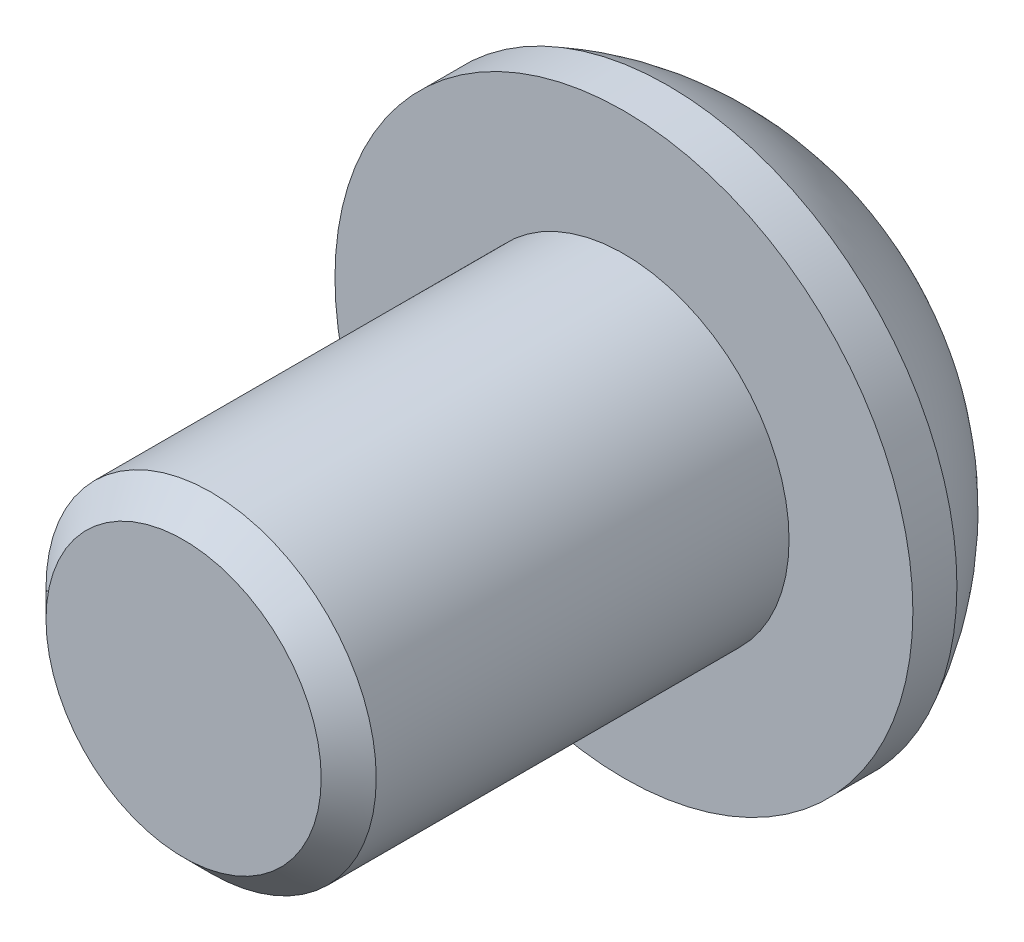
ISO-10303-21;
HEADER;
FILE_DESCRIPTION(('STEP AP214'),'2;1');
FILE_NAME('part.step','',(''),(''),'','','');
FILE_SCHEMA(('AUTOMOTIVE_DESIGN { 1 0 10303 214 1 1 1 1 }'));
ENDSEC;
DATA;
#1=APPLICATION_CONTEXT('core data for automotive mechanical design processes');
#2=APPLICATION_PROTOCOL_DEFINITION('international standard','automotive_design',2000,#1);
#3=PRODUCT_CONTEXT('',#1,'mechanical');
#4=PRODUCT('Part','Part','',(#3));
#5=PRODUCT_RELATED_PRODUCT_CATEGORY('part','',(#4));
#6=PRODUCT_DEFINITION_FORMATION('','',#4);
#7=PRODUCT_DEFINITION_CONTEXT('part definition',#1,'design');
#8=PRODUCT_DEFINITION('design','',#6,#7);
#9=PRODUCT_DEFINITION_SHAPE('','',#8);
#10=(LENGTH_UNIT() NAMED_UNIT(*) SI_UNIT(.MILLI.,.METRE.));
#11=(NAMED_UNIT(*) PLANE_ANGLE_UNIT() SI_UNIT($,.RADIAN.));
#12=(NAMED_UNIT(*) SI_UNIT($,.STERADIAN.) SOLID_ANGLE_UNIT());
#13=UNCERTAINTY_MEASURE_WITH_UNIT(LENGTH_MEASURE(1.E-05),#10,'distance_accuracy_value','');
#14=(GEOMETRIC_REPRESENTATION_CONTEXT(3) GLOBAL_UNCERTAINTY_ASSIGNED_CONTEXT((#13)) GLOBAL_UNIT_ASSIGNED_CONTEXT((#10,
#11,#12)) REPRESENTATION_CONTEXT('',''));
#15=CARTESIAN_POINT('',(0.,0.,0.));
#16=DIRECTION('',(0.,0.,1.));
#17=DIRECTION('',(1.,0.,0.));
#18=AXIS2_PLACEMENT_3D('',#15,#16,#17);
#19=CARTESIAN_POINT('',(0.,0.,-1.57));
#20=DIRECTION('',(0.,0.,1.));
#21=DIRECTION('',(1.,0.,0.));
#22=AXIS2_PLACEMENT_3D('',#19,#20,#21);
#23=PLANE('',#22);
#24=DIRECTION('',(0.866025403784439,0.499999999999999,0.));
#25=VECTOR('',#24,1.);
#26=CARTESIAN_POINT('',(2.,-1.15470053837925,-1.57));
#27=LINE('',#26,#25);
#28=CARTESIAN_POINT('',(2.,-1.15470053837925,-1.57));
#29=VERTEX_POINT('',#28);
#30=CARTESIAN_POINT('',(0.,-2.3094010767585,-1.57));
#31=VERTEX_POINT('',#30);
#32=EDGE_CURVE('E130',#29,#31,#27,.F.);
#33=ORIENTED_EDGE('',*,*,#32,.T.);
#34=DIRECTION('',(0.866025403784438,-0.5,0.));
#35=VECTOR('',#34,1.);
#36=CARTESIAN_POINT('',(0.,-2.3094010767585,-1.57));
#37=LINE('',#36,#35);
#38=CARTESIAN_POINT('',(-2.,-1.15470053837925,-1.57));
#39=VERTEX_POINT('',#38);
#40=EDGE_CURVE('E134',#31,#39,#37,.F.);
#41=ORIENTED_EDGE('',*,*,#40,.T.);
#42=DIRECTION('',(0.,1.,0.));
#43=VECTOR('',#42,1.);
#44=CARTESIAN_POINT('',(-2.,-1.15470053837925,-1.57));
#45=LINE('',#44,#43);
#46=CARTESIAN_POINT('',(-2.,1.15470053837925,-1.57));
#47=VERTEX_POINT('',#46);
#48=EDGE_CURVE('E68',#39,#47,#45,.T.);
#49=ORIENTED_EDGE('',*,*,#48,.T.);
#50=DIRECTION('',(-0.866025403784439,-0.5,0.));
#51=VECTOR('',#50,1.);
#52=CARTESIAN_POINT('',(-2.,1.15470053837925,-1.57));
#53=LINE('',#52,#51);
#54=CARTESIAN_POINT('',(0.,2.3094010767585,-1.57));
#55=VERTEX_POINT('',#54);
#56=EDGE_CURVE('E70',#47,#55,#53,.F.);
#57=ORIENTED_EDGE('',*,*,#56,.T.);
#58=DIRECTION('',(-0.866025403784439,0.5,0.));
#59=VECTOR('',#58,1.);
#60=CARTESIAN_POINT('',(0.,2.3094010767585,-1.57));
#61=LINE('',#60,#59);
#62=CARTESIAN_POINT('',(2.,1.15470053837925,-1.57));
#63=VERTEX_POINT('',#62);
#64=EDGE_CURVE('E72',#55,#63,#61,.F.);
#65=ORIENTED_EDGE('',*,*,#64,.T.);
#66=DIRECTION('',(0.,1.,0.));
#67=VECTOR('',#66,1.);
#68=CARTESIAN_POINT('',(2.,1.15470053837925,-1.57));
#69=LINE('',#68,#67);
#70=EDGE_CURVE('E125',#63,#29,#69,.F.);
#71=ORIENTED_EDGE('',*,*,#70,.T.);
#72=EDGE_LOOP('',(#33,#41,#49,#57,#65,#71));
#73=FACE_BOUND('',#72,.T.);
#74=ADVANCED_FACE('F17',(#73),#23,.F.);
#75=CARTESIAN_POINT('',(0.,2.3094010767585,-3.3));
#76=DIRECTION('',(0.5,0.866025403784439,0.));
#77=DIRECTION('',(-0.866025403784439,0.5,0.));
#78=AXIS2_PLACEMENT_3D('',#75,#76,#77);
#79=PLANE('',#78);
#80=ORIENTED_EDGE('',*,*,#64,.F.);
#81=DIRECTION('',(0.,0.,1.));
#82=VECTOR('',#81,1.);
#83=CARTESIAN_POINT('',(0.,2.3094010767585,-3.3));
#84=LINE('',#83,#82);
#85=CARTESIAN_POINT('',(0.,2.3094010767585,-3.3));
#86=VERTEX_POINT('',#85);
#87=EDGE_CURVE('E77',#55,#86,#84,.F.);
#88=ORIENTED_EDGE('',*,*,#87,.T.);
#89=DIRECTION('',(-0.866025403784439,0.5,0.));
#90=VECTOR('',#89,1.);
#91=CARTESIAN_POINT('',(2.,1.15470053837925,-3.3));
#92=LINE('',#91,#90);
#93=CARTESIAN_POINT('',(2.,1.15470053837925,-3.3));
#94=VERTEX_POINT('',#93);
#95=EDGE_CURVE('E122',#94,#86,#92,.T.);
#96=ORIENTED_EDGE('',*,*,#95,.F.);
#97=DIRECTION('',(0.,0.,-1.));
#98=VECTOR('',#97,1.);
#99=CARTESIAN_POINT('',(2.,1.15470053837925,-3.3));
#100=LINE('',#99,#98);
#101=EDGE_CURVE('E83',#94,#63,#100,.F.);
#102=ORIENTED_EDGE('',*,*,#101,.T.);
#103=EDGE_LOOP('',(#80,#88,#96,#102));
#104=FACE_BOUND('',#103,.T.);
#105=ADVANCED_FACE('F80',(#104),#79,.F.);
#106=CARTESIAN_POINT('',(-2.,1.15470053837925,-3.3));
#107=DIRECTION('',(-0.5,0.866025403784439,0.));
#108=DIRECTION('',(-0.866025403784439,-0.5,0.));
#109=AXIS2_PLACEMENT_3D('',#106,#107,#108);
#110=PLANE('',#109);
#111=ORIENTED_EDGE('',*,*,#56,.F.);
#112=DIRECTION('',(0.,0.,1.));
#113=VECTOR('',#112,1.);
#114=CARTESIAN_POINT('',(-2.,1.15470053837925,-3.3));
#115=LINE('',#114,#113);
#116=CARTESIAN_POINT('',(-2.,1.15470053837925,-3.3));
#117=VERTEX_POINT('',#116);
#118=EDGE_CURVE('E91',#47,#117,#115,.F.);
#119=ORIENTED_EDGE('',*,*,#118,.T.);
#120=DIRECTION('',(-0.866025403784439,-0.499999999999999,0.));
#121=VECTOR('',#120,1.);
#122=CARTESIAN_POINT('',(0.,2.3094010767585,-3.3));
#123=LINE('',#122,#121);
#124=EDGE_CURVE('E88',#86,#117,#123,.T.);
#125=ORIENTED_EDGE('',*,*,#124,.F.);
#126=ORIENTED_EDGE('',*,*,#87,.F.);
#127=EDGE_LOOP('',(#111,#119,#125,#126));
#128=FACE_BOUND('',#127,.T.);
#129=ADVANCED_FACE('F86',(#128),#110,.F.);
#130=CARTESIAN_POINT('',(-2.,-1.15470053837925,-3.3));
#131=DIRECTION('',(-1.,0.,0.));
#132=DIRECTION('',(0.,0.,1.));
#133=AXIS2_PLACEMENT_3D('',#130,#131,#132);
#134=PLANE('',#133);
#135=ORIENTED_EDGE('',*,*,#48,.F.);
#136=DIRECTION('',(0.,0.,1.));
#137=VECTOR('',#136,1.);
#138=CARTESIAN_POINT('',(-2.,-1.15470053837925,-3.3));
#139=LINE('',#138,#137);
#140=CARTESIAN_POINT('',(-2.,-1.15470053837925,-3.3));
#141=VERTEX_POINT('',#140);
#142=EDGE_CURVE('E132',#39,#141,#139,.F.);
#143=ORIENTED_EDGE('',*,*,#142,.T.);
#144=DIRECTION('',(0.,1.,0.));
#145=VECTOR('',#144,1.);
#146=CARTESIAN_POINT('',(-2.,-1.3125,-3.3));
#147=LINE('',#146,#145);
#148=EDGE_CURVE('E118',#117,#141,#147,.F.);
#149=ORIENTED_EDGE('',*,*,#148,.F.);
#150=ORIENTED_EDGE('',*,*,#118,.F.);
#151=EDGE_LOOP('',(#135,#143,#149,#150));
#152=FACE_BOUND('',#151,.T.);
#153=ADVANCED_FACE('F137',(#152),#134,.F.);
#154=CARTESIAN_POINT('',(0.,-2.3094010767585,-3.3));
#155=DIRECTION('',(-0.5,-0.866025403784438,0.));
#156=DIRECTION('',(0.866025403784438,-0.5,0.));
#157=AXIS2_PLACEMENT_3D('',#154,#155,#156);
#158=PLANE('',#157);
#159=ORIENTED_EDGE('',*,*,#40,.F.);
#160=DIRECTION('',(0.,0.,1.));
#161=VECTOR('',#160,1.);
#162=CARTESIAN_POINT('',(0.,-2.3094010767585,-3.3));
#163=LINE('',#162,#161);
#164=CARTESIAN_POINT('',(0.,-2.3094010767585,-3.3));
#165=VERTEX_POINT('',#164);
#166=EDGE_CURVE('E128',#31,#165,#163,.F.);
#167=ORIENTED_EDGE('',*,*,#166,.T.);
#168=DIRECTION('',(0.866025403784439,-0.5,0.));
#169=VECTOR('',#168,1.);
#170=CARTESIAN_POINT('',(-2.,-1.15470053837925,-3.3));
#171=LINE('',#170,#169);
#172=EDGE_CURVE('E115',#141,#165,#171,.T.);
#173=ORIENTED_EDGE('',*,*,#172,.F.);
#174=ORIENTED_EDGE('',*,*,#142,.F.);
#175=EDGE_LOOP('',(#159,#167,#173,#174));
#176=FACE_BOUND('',#175,.T.);
#177=ADVANCED_FACE('F149',(#176),#158,.F.);
#178=CARTESIAN_POINT('',(2.,-1.15470053837925,-3.3));
#179=DIRECTION('',(0.499999999999999,-0.866025403784439,0.));
#180=DIRECTION('',(0.866025403784439,0.499999999999999,0.));
#181=AXIS2_PLACEMENT_3D('',#178,#179,#180);
#182=PLANE('',#181);
#183=ORIENTED_EDGE('',*,*,#32,.F.);
#184=DIRECTION('',(0.,0.,-1.));
#185=VECTOR('',#184,1.);
#186=CARTESIAN_POINT('',(2.,-1.15470053837925,-3.3));
#187=LINE('',#186,#185);
#188=CARTESIAN_POINT('',(2.,-1.15470053837925,-3.3));
#189=VERTEX_POINT('',#188);
#190=EDGE_CURVE('E35',#29,#189,#187,.T.);
#191=ORIENTED_EDGE('',*,*,#190,.T.);
#192=DIRECTION('',(0.866025403784439,0.499999999999999,0.));
#193=VECTOR('',#192,1.);
#194=CARTESIAN_POINT('',(0.,-2.3094010767585,-3.3));
#195=LINE('',#194,#193);
#196=EDGE_CURVE('E112',#165,#189,#195,.T.);
#197=ORIENTED_EDGE('',*,*,#196,.F.);
#198=ORIENTED_EDGE('',*,*,#166,.F.);
#199=EDGE_LOOP('',(#183,#191,#197,#198));
#200=FACE_BOUND('',#199,.T.);
#201=ADVANCED_FACE('F147',(#200),#182,.F.);
#202=CARTESIAN_POINT('',(2.,1.15470053837925,-3.3));
#203=DIRECTION('',(1.,0.,0.));
#204=DIRECTION('',(0.,0.,-1.));
#205=AXIS2_PLACEMENT_3D('',#202,#203,#204);
#206=PLANE('',#205);
#207=ORIENTED_EDGE('',*,*,#70,.F.);
#208=ORIENTED_EDGE('',*,*,#101,.F.);
#209=DIRECTION('',(0.,1.,0.));
#210=VECTOR('',#209,1.);
#211=CARTESIAN_POINT('',(2.,-1.3125,-3.3));
#212=LINE('',#211,#210);
#213=EDGE_CURVE('E107',#189,#94,#212,.T.);
#214=ORIENTED_EDGE('',*,*,#213,.F.);
#215=ORIENTED_EDGE('',*,*,#190,.F.);
#216=EDGE_LOOP('',(#207,#208,#214,#215));
#217=FACE_BOUND('',#216,.T.);
#218=ADVANCED_FACE('F144',(#217),#206,.F.);
#219=CARTESIAN_POINT('',(0.,-1.3125,-3.3));
#220=DIRECTION('',(0.,0.,-1.));
#221=DIRECTION('',(-1.,0.,0.));
#222=AXIS2_PLACEMENT_3D('',#219,#220,#221);
#223=PLANE('',#222);
#224=ORIENTED_EDGE('',*,*,#196,.T.);
#225=ORIENTED_EDGE('',*,*,#213,.T.);
#226=ORIENTED_EDGE('',*,*,#95,.T.);
#227=ORIENTED_EDGE('',*,*,#124,.T.);
#228=ORIENTED_EDGE('',*,*,#148,.T.);
#229=ORIENTED_EDGE('',*,*,#172,.T.);
#230=EDGE_LOOP('',(#224,#225,#226,#227,#228,#229));
#231=FACE_BOUND('',#230,.T.);
#232=CARTESIAN_POINT('',(0.,0.,-3.3));
#233=DIRECTION('',(0.,0.,-1.));
#234=DIRECTION('',(-1.,0.,0.));
#235=AXIS2_PLACEMENT_3D('',#232,#233,#234);
#236=CIRCLE('',#235,2.625);
#237=CARTESIAN_POINT('',(-2.625,0.,-3.3));
#238=VERTEX_POINT('',#237);
#239=EDGE_CURVE('E20',#238,#238,#236,.F.);
#240=ORIENTED_EDGE('',*,*,#239,.F.);
#241=EDGE_LOOP('',(#240));
#242=FACE_BOUND('',#241,.T.);
#243=ADVANCED_FACE('F141',(#231,#242),#223,.T.);
#244=CARTESIAN_POINT('',(0.,0.,1.618125));
#245=DIRECTION('',(0.,0.,-1.));
#246=DIRECTION('',(0.,-1.,0.));
#247=AXIS2_PLACEMENT_3D('',#244,#245,#246);
#248=DEGENERATE_TOROIDAL_SURFACE('',#247,0.444047619047619,5.38000992597661,.T.);
#249=CARTESIAN_POINT('',(0.,0.,-0.800000000000002));
#250=DIRECTION('',(0.,0.,-1.));
#251=DIRECTION('',(-1.,0.,0.));
#252=AXIS2_PLACEMENT_3D('',#249,#250,#251);
#253=CIRCLE('',#252,5.25);
#254=CARTESIAN_POINT('',(-5.25,0.,-0.800000000000002));
#255=VERTEX_POINT('',#254);
#256=EDGE_CURVE('E99',#255,#255,#253,.F.);
#257=ORIENTED_EDGE('',*,*,#256,.F.);
#258=EDGE_LOOP('',(#257));
#259=FACE_BOUND('',#258,.T.);
#260=ORIENTED_EDGE('',*,*,#239,.T.);
#261=EDGE_LOOP('',(#260));
#262=FACE_BOUND('',#261,.T.);
#263=ADVANCED_FACE('F182',(#259,#262),#248,.T.);
#264=CARTESIAN_POINT('',(0.,0.,8.));
#265=DIRECTION('',(0.,0.,1.));
#266=DIRECTION('',(1.,0.,0.));
#267=AXIS2_PLACEMENT_3D('',#264,#265,#266);
#268=PLANE('',#267);
#269=CARTESIAN_POINT('',(0.,0.,8.0000000000382));
#270=DIRECTION('',(0.,0.,-1.));
#271=DIRECTION('',(-1.,0.,0.));
#272=AXIS2_PLACEMENT_3D('',#269,#270,#271);
#273=CIRCLE('',#272,2.49999999994088);
#274=CARTESIAN_POINT('',(-2.49999999994088,0.,8.0000000000382));
#275=VERTEX_POINT('',#274);
#276=EDGE_CURVE('E97',#275,#275,#273,.T.);
#277=ORIENTED_EDGE('',*,*,#276,.F.);
#278=EDGE_LOOP('',(#277));
#279=FACE_BOUND('',#278,.T.);
#280=ADVANCED_FACE('F178',(#279),#268,.T.);
#281=CARTESIAN_POINT('',(0.,0.,-0.4));
#282=DIRECTION('',(0.,0.,-1.));
#283=DIRECTION('',(-1.,0.,0.));
#284=AXIS2_PLACEMENT_3D('',#281,#282,#283);
#285=CYLINDRICAL_SURFACE('',#284,5.25);
#286=CARTESIAN_POINT('',(0.,0.,0.));
#287=DIRECTION('',(0.,0.,-1.));
#288=DIRECTION('',(-1.,0.,0.));
#289=AXIS2_PLACEMENT_3D('',#286,#287,#288);
#290=CIRCLE('',#289,5.25);
#291=CARTESIAN_POINT('',(-5.25,0.,0.));
#292=VERTEX_POINT('',#291);
#293=EDGE_CURVE('E95',#292,#292,#290,.T.);
#294=ORIENTED_EDGE('',*,*,#293,.T.);
#295=EDGE_LOOP('',(#294));
#296=FACE_BOUND('',#295,.T.);
#297=ORIENTED_EDGE('',*,*,#256,.T.);
#298=EDGE_LOOP('',(#297));
#299=FACE_BOUND('',#298,.T.);
#300=ADVANCED_FACE('F174',(#296,#299),#285,.T.);
#301=CARTESIAN_POINT('',(0.,0.,7.50000000010687));
#302=DIRECTION('',(0.,0.,-1.));
#303=DIRECTION('',(-1.,0.,0.));
#304=AXIS2_PLACEMENT_3D('',#301,#302,#303);
#305=CONICAL_SURFACE('',#304,2.99999999987222,0.785398163397448);
#306=CARTESIAN_POINT('',(0.,0.,7.5));
#307=DIRECTION('',(0.,0.,1.));
#308=DIRECTION('',(1.,0.,0.));
#309=AXIS2_PLACEMENT_3D('',#306,#307,#308);
#310=CIRCLE('',#309,3.);
#311=CARTESIAN_POINT('',(3.,0.,7.5));
#312=VERTEX_POINT('',#311);
#313=EDGE_CURVE('E26',#312,#312,#310,.F.);
#314=ORIENTED_EDGE('',*,*,#313,.F.);
#315=EDGE_LOOP('',(#314));
#316=FACE_BOUND('',#315,.T.);
#317=ORIENTED_EDGE('',*,*,#276,.T.);
#318=EDGE_LOOP('',(#317));
#319=FACE_BOUND('',#318,.T.);
#320=ADVANCED_FACE('F167',(#316,#319),#305,.T.);
#321=CARTESIAN_POINT('',(0.,-2.625,0.));
#322=DIRECTION('',(0.,0.,-1.));
#323=DIRECTION('',(-1.,0.,0.));
#324=AXIS2_PLACEMENT_3D('',#321,#322,#323);
#325=PLANE('',#324);
#326=ORIENTED_EDGE('',*,*,#293,.F.);
#327=EDGE_LOOP('',(#326));
#328=FACE_BOUND('',#327,.T.);
#329=CARTESIAN_POINT('',(0.,0.,0.));
#330=DIRECTION('',(0.,0.,1.));
#331=DIRECTION('',(1.,0.,0.));
#332=AXIS2_PLACEMENT_3D('',#329,#330,#331);
#333=CIRCLE('',#332,3.);
#334=CARTESIAN_POINT('',(3.,0.,0.));
#335=VERTEX_POINT('',#334);
#336=EDGE_CURVE('E11',#335,#335,#333,.T.);
#337=ORIENTED_EDGE('',*,*,#336,.F.);
#338=EDGE_LOOP('',(#337));
#339=FACE_BOUND('',#338,.T.);
#340=ADVANCED_FACE('F161',(#328,#339),#325,.F.);
#341=CARTESIAN_POINT('',(0.,0.,0.));
#342=DIRECTION('',(0.,0.,1.));
#343=DIRECTION('',(1.,0.,0.));
#344=AXIS2_PLACEMENT_3D('',#341,#342,#343);
#345=CYLINDRICAL_SURFACE('',#344,3.);
#346=ORIENTED_EDGE('',*,*,#336,.T.);
#347=EDGE_LOOP('',(#346));
#348=FACE_BOUND('',#347,.T.);
#349=ORIENTED_EDGE('',*,*,#313,.T.);
#350=EDGE_LOOP('',(#349));
#351=FACE_BOUND('',#350,.T.);
#352=ADVANCED_FACE('F159',(#348,#351),#345,.T.);
#353=CLOSED_SHELL('',(#74,#105,#129,#153,#177,#201,#218,#243,#263,#280,#300,#320,#340,#352));
#354=MANIFOLD_SOLID_BREP('B1',#353);
#355=ADVANCED_BREP_SHAPE_REPRESENTATION('',(#18,#354),#14);
#356=SHAPE_DEFINITION_REPRESENTATION(#9,#355);
ENDSEC;
END-ISO-10303-21;
